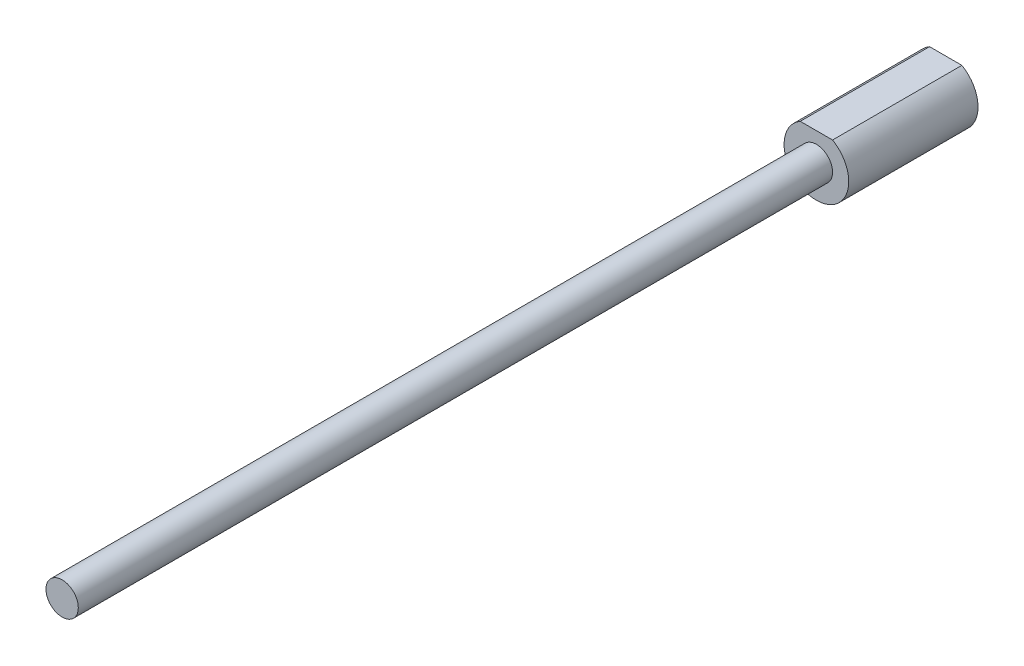
ISO-10303-21;
HEADER;
FILE_DESCRIPTION(('STEP AP214'),'2;1');
FILE_NAME('part.step','',(''),(''),'','','');
FILE_SCHEMA(('AUTOMOTIVE_DESIGN { 1 0 10303 214 1 1 1 1 }'));
ENDSEC;
DATA;
#1=APPLICATION_CONTEXT('core data for automotive mechanical design processes');
#2=APPLICATION_PROTOCOL_DEFINITION('international standard','automotive_design',2000,#1);
#3=PRODUCT_CONTEXT('',#1,'mechanical');
#4=PRODUCT('Part','Part','',(#3));
#5=PRODUCT_RELATED_PRODUCT_CATEGORY('part','',(#4));
#6=PRODUCT_DEFINITION_FORMATION('','',#4);
#7=PRODUCT_DEFINITION_CONTEXT('part definition',#1,'design');
#8=PRODUCT_DEFINITION('design','',#6,#7);
#9=PRODUCT_DEFINITION_SHAPE('','',#8);
#10=(LENGTH_UNIT() NAMED_UNIT(*) SI_UNIT(.MILLI.,.METRE.));
#11=(NAMED_UNIT(*) PLANE_ANGLE_UNIT() SI_UNIT($,.RADIAN.));
#12=(NAMED_UNIT(*) SI_UNIT($,.STERADIAN.) SOLID_ANGLE_UNIT());
#13=UNCERTAINTY_MEASURE_WITH_UNIT(LENGTH_MEASURE(1.E-05),#10,'distance_accuracy_value','');
#14=(GEOMETRIC_REPRESENTATION_CONTEXT(3) GLOBAL_UNCERTAINTY_ASSIGNED_CONTEXT((#13)) GLOBAL_UNIT_ASSIGNED_CONTEXT((#10,
#11,#12)) REPRESENTATION_CONTEXT('',''));
#15=CARTESIAN_POINT('',(0.,0.,0.));
#16=DIRECTION('',(0.,0.,1.));
#17=DIRECTION('',(1.,0.,0.));
#18=AXIS2_PLACEMENT_3D('',#15,#16,#17);
#19=CARTESIAN_POINT('',(0.,0.,-26.1));
#20=DIRECTION('',(0.,0.,-1.));
#21=DIRECTION('',(-1.,0.,0.));
#22=AXIS2_PLACEMENT_3D('',#19,#20,#21);
#23=CYLINDRICAL_SURFACE('',#22,1.5);
#24=DIRECTION('',(0.,0.,-1.));
#25=VECTOR('',#24,1.);
#26=CARTESIAN_POINT('',(-0.75,1.29903810567666,-26.1));
#27=LINE('',#26,#25);
#28=CARTESIAN_POINT('',(-0.75,1.29903810567666,-26.1));
#29=VERTEX_POINT('',#28);
#30=CARTESIAN_POINT('',(-0.75,1.29903810567666,-32.1));
#31=VERTEX_POINT('',#30);
#32=EDGE_CURVE('E49',#29,#31,#27,.T.);
#33=ORIENTED_EDGE('',*,*,#32,.T.);
#34=CARTESIAN_POINT('',(0.,0.,-32.1));
#35=DIRECTION('',(0.,0.,-1.));
#36=DIRECTION('',(-1.,0.,0.));
#37=AXIS2_PLACEMENT_3D('',#34,#35,#36);
#38=CIRCLE('',#37,1.5);
#39=CARTESIAN_POINT('',(0.75,1.29903810567666,-32.1));
#40=VERTEX_POINT('',#39);
#41=EDGE_CURVE('E73',#40,#31,#38,.T.);
#42=ORIENTED_EDGE('',*,*,#41,.F.);
#43=DIRECTION('',(0.,0.,-1.));
#44=VECTOR('',#43,1.);
#45=CARTESIAN_POINT('',(0.75,1.29903810567666,-26.1));
#46=LINE('',#45,#44);
#47=CARTESIAN_POINT('',(0.75,1.29903810567666,-26.1));
#48=VERTEX_POINT('',#47);
#49=EDGE_CURVE('E54',#48,#40,#46,.T.);
#50=ORIENTED_EDGE('',*,*,#49,.F.);
#51=CARTESIAN_POINT('',(0.,0.,-26.1));
#52=DIRECTION('',(0.,0.,-1.));
#53=DIRECTION('',(-1.,0.,0.));
#54=AXIS2_PLACEMENT_3D('',#51,#52,#53);
#55=CIRCLE('',#54,1.5);
#56=EDGE_CURVE('E74',#48,#29,#55,.T.);
#57=ORIENTED_EDGE('',*,*,#56,.T.);
#58=EDGE_LOOP('',(#33,#42,#50,#57));
#59=FACE_BOUND('',#58,.T.);
#60=ADVANCED_FACE('F46',(#59),#23,.T.);
#61=CARTESIAN_POINT('',(0.75,1.29903810567666,-26.1));
#62=DIRECTION('',(0.,1.,0.));
#63=DIRECTION('',(0.,0.,1.));
#64=AXIS2_PLACEMENT_3D('',#61,#62,#63);
#65=PLANE('',#64);
#66=ORIENTED_EDGE('',*,*,#49,.T.);
#67=DIRECTION('',(1.,0.,0.));
#68=VECTOR('',#67,1.);
#69=CARTESIAN_POINT('',(0.75,1.29903810567666,-32.1));
#70=LINE('',#69,#68);
#71=EDGE_CURVE('E78',#31,#40,#70,.T.);
#72=ORIENTED_EDGE('',*,*,#71,.F.);
#73=ORIENTED_EDGE('',*,*,#32,.F.);
#74=DIRECTION('',(1.,0.,0.));
#75=VECTOR('',#74,1.);
#76=CARTESIAN_POINT('',(0.75,1.29903810567666,-26.1));
#77=LINE('',#76,#75);
#78=EDGE_CURVE('E76',#29,#48,#77,.T.);
#79=ORIENTED_EDGE('',*,*,#78,.T.);
#80=EDGE_LOOP('',(#66,#72,#73,#79));
#81=FACE_BOUND('',#80,.T.);
#82=ADVANCED_FACE('F79',(#81),#65,.T.);
#83=CARTESIAN_POINT('',(0.,0.,-26.1));
#84=DIRECTION('',(0.,0.,-1.));
#85=DIRECTION('',(-1.,0.,0.));
#86=AXIS2_PLACEMENT_3D('',#83,#84,#85);
#87=PLANE('',#86);
#88=CARTESIAN_POINT('',(0.,0.,-26.1));
#89=DIRECTION('',(0.,0.,1.));
#90=DIRECTION('',(1.,0.,0.));
#91=AXIS2_PLACEMENT_3D('',#88,#89,#90);
#92=CIRCLE('',#91,0.75);
#93=CARTESIAN_POINT('',(0.75,0.,-26.1));
#94=VERTEX_POINT('',#93);
#95=EDGE_CURVE('E13',#94,#94,#92,.T.);
#96=ORIENTED_EDGE('',*,*,#95,.F.);
#97=EDGE_LOOP('',(#96));
#98=FACE_BOUND('',#97,.T.);
#99=ORIENTED_EDGE('',*,*,#56,.F.);
#100=ORIENTED_EDGE('',*,*,#78,.F.);
#101=EDGE_LOOP('',(#99,#100));
#102=FACE_BOUND('',#101,.T.);
#103=ADVANCED_FACE('F90',(#98,#102),#87,.F.);
#104=CARTESIAN_POINT('',(0.,0.,-32.1));
#105=DIRECTION('',(0.,0.,-1.));
#106=DIRECTION('',(-1.,0.,0.));
#107=AXIS2_PLACEMENT_3D('',#104,#105,#106);
#108=PLANE('',#107);
#109=ORIENTED_EDGE('',*,*,#41,.T.);
#110=ORIENTED_EDGE('',*,*,#71,.T.);
#111=EDGE_LOOP('',(#109,#110));
#112=FACE_BOUND('',#111,.T.);
#113=ADVANCED_FACE('F82',(#112),#108,.T.);
#114=CARTESIAN_POINT('',(0.,0.,8.90000000000001));
#115=DIRECTION('',(0.,0.,-1.));
#116=DIRECTION('',(-1.,0.,0.));
#117=AXIS2_PLACEMENT_3D('',#114,#115,#116);
#118=CYLINDRICAL_SURFACE('',#117,0.75);
#119=CARTESIAN_POINT('',(0.,0.,8.90000000000001));
#120=DIRECTION('',(0.,0.,1.));
#121=DIRECTION('',(1.,0.,0.));
#122=AXIS2_PLACEMENT_3D('',#119,#120,#121);
#123=CIRCLE('',#122,0.75);
#124=CARTESIAN_POINT('',(0.75,0.,8.90000000000001));
#125=VERTEX_POINT('',#124);
#126=EDGE_CURVE('E83',#125,#125,#123,.T.);
#127=ORIENTED_EDGE('',*,*,#126,.F.);
#128=EDGE_LOOP('',(#127));
#129=FACE_BOUND('',#128,.T.);
#130=ORIENTED_EDGE('',*,*,#95,.T.);
#131=EDGE_LOOP('',(#130));
#132=FACE_BOUND('',#131,.T.);
#133=ADVANCED_FACE('F98',(#129,#132),#118,.T.);
#134=CARTESIAN_POINT('',(0.,0.,8.90000000000001));
#135=DIRECTION('',(0.,0.,1.));
#136=DIRECTION('',(1.,0.,0.));
#137=AXIS2_PLACEMENT_3D('',#134,#135,#136);
#138=PLANE('',#137);
#139=ORIENTED_EDGE('',*,*,#126,.T.);
#140=EDGE_LOOP('',(#139));
#141=FACE_BOUND('',#140,.T.);
#142=ADVANCED_FACE('F127',(#141),#138,.T.);
#143=CLOSED_SHELL('',(#60,#82,#103,#113,#133,#142));
#144=MANIFOLD_SOLID_BREP('B2',#143);
#145=ADVANCED_BREP_SHAPE_REPRESENTATION('',(#18,#144),#14);
#146=SHAPE_DEFINITION_REPRESENTATION(#9,#145);
ENDSEC;
END-ISO-10303-21;
